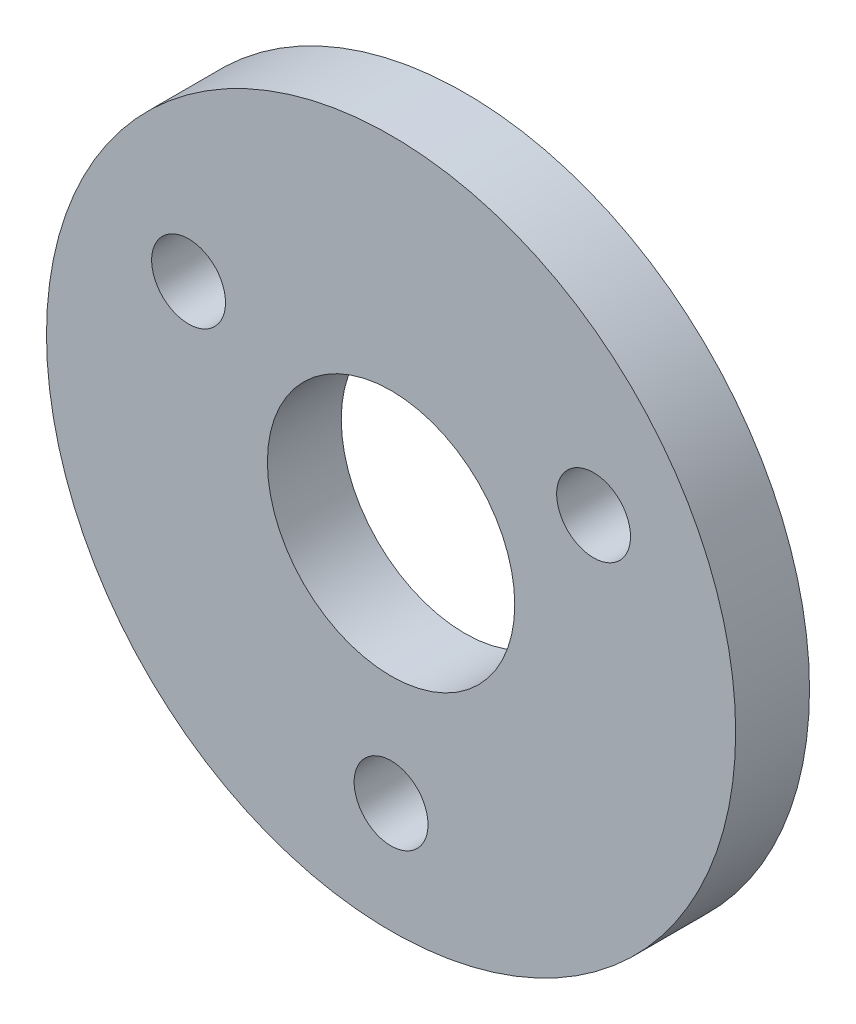
ISO-10303-21;
HEADER;
FILE_DESCRIPTION(('STEP AP214'),'2;1');
FILE_NAME('part.step','',(''),(''),'','','');
FILE_SCHEMA(('AUTOMOTIVE_DESIGN { 1 0 10303 214 1 1 1 1 }'));
ENDSEC;
DATA;
#1=APPLICATION_CONTEXT('core data for automotive mechanical design processes');
#2=APPLICATION_PROTOCOL_DEFINITION('international standard','automotive_design',2000,#1);
#3=PRODUCT_CONTEXT('',#1,'mechanical');
#4=PRODUCT('Part','Part','',(#3));
#5=PRODUCT_RELATED_PRODUCT_CATEGORY('part','',(#4));
#6=PRODUCT_DEFINITION_FORMATION('','',#4);
#7=PRODUCT_DEFINITION_CONTEXT('part definition',#1,'design');
#8=PRODUCT_DEFINITION('design','',#6,#7);
#9=PRODUCT_DEFINITION_SHAPE('','',#8);
#10=(LENGTH_UNIT() NAMED_UNIT(*) SI_UNIT(.MILLI.,.METRE.));
#11=(NAMED_UNIT(*) PLANE_ANGLE_UNIT() SI_UNIT($,.RADIAN.));
#12=(NAMED_UNIT(*) SI_UNIT($,.STERADIAN.) SOLID_ANGLE_UNIT());
#13=UNCERTAINTY_MEASURE_WITH_UNIT(LENGTH_MEASURE(1.E-05),#10,'distance_accuracy_value','');
#14=(GEOMETRIC_REPRESENTATION_CONTEXT(3) GLOBAL_UNCERTAINTY_ASSIGNED_CONTEXT((#13)) GLOBAL_UNIT_ASSIGNED_CONTEXT((#10,
#11,#12)) REPRESENTATION_CONTEXT('',''));
#15=CARTESIAN_POINT('',(0.,0.,0.));
#16=DIRECTION('',(0.,0.,1.));
#17=DIRECTION('',(1.,0.,0.));
#18=AXIS2_PLACEMENT_3D('',#15,#16,#17);
#19=CARTESIAN_POINT('',(0.,0.,3.));
#20=DIRECTION('',(0.,0.,1.));
#21=DIRECTION('',(1.,0.,0.));
#22=AXIS2_PLACEMENT_3D('',#19,#20,#21);
#23=PLANE('',#22);
#24=CARTESIAN_POINT('',(-8.22724133595208,4.75000000000015,3.));
#25=DIRECTION('',(0.,0.,1.));
#26=DIRECTION('',(1.,0.,0.));
#27=AXIS2_PLACEMENT_3D('',#24,#25,#26);
#28=CIRCLE('',#27,1.5);
#29=CARTESIAN_POINT('',(-6.72724133595208,4.75000000000015,3.));
#30=VERTEX_POINT('',#29);
#31=EDGE_CURVE('E55',#30,#30,#28,.T.);
#32=ORIENTED_EDGE('',*,*,#31,.F.);
#33=EDGE_LOOP('',(#32));
#34=FACE_BOUND('',#33,.T.);
#35=CARTESIAN_POINT('',(0.,0.,3.));
#36=DIRECTION('',(0.,0.,1.));
#37=DIRECTION('',(1.,0.,0.));
#38=AXIS2_PLACEMENT_3D('',#35,#36,#37);
#39=CIRCLE('',#38,5.025);
#40=CARTESIAN_POINT('',(5.025,0.,3.));
#41=VERTEX_POINT('',#40);
#42=EDGE_CURVE('E44',#41,#41,#39,.T.);
#43=ORIENTED_EDGE('',*,*,#42,.F.);
#44=EDGE_LOOP('',(#43));
#45=FACE_BOUND('',#44,.T.);
#46=CARTESIAN_POINT('',(0.,0.,3.));
#47=DIRECTION('',(0.,0.,1.));
#48=DIRECTION('',(1.,0.,0.));
#49=AXIS2_PLACEMENT_3D('',#46,#47,#48);
#50=CIRCLE('',#49,14.);
#51=CARTESIAN_POINT('',(14.,0.,3.));
#52=VERTEX_POINT('',#51);
#53=EDGE_CURVE('E10',#52,#52,#50,.T.);
#54=ORIENTED_EDGE('',*,*,#53,.T.);
#55=EDGE_LOOP('',(#54));
#56=FACE_BOUND('',#55,.T.);
#57=CARTESIAN_POINT('',(0.,-9.5,3.));
#58=DIRECTION('',(0.,0.,1.));
#59=DIRECTION('',(1.,0.,0.));
#60=AXIS2_PLACEMENT_3D('',#57,#58,#59);
#61=CIRCLE('',#60,1.5);
#62=CARTESIAN_POINT('',(1.5,-9.5,3.));
#63=VERTEX_POINT('',#62);
#64=EDGE_CURVE('E49',#63,#63,#61,.T.);
#65=ORIENTED_EDGE('',*,*,#64,.F.);
#66=EDGE_LOOP('',(#65));
#67=FACE_BOUND('',#66,.T.);
#68=CARTESIAN_POINT('',(8.22724133595221,4.74999999999992,3.));
#69=DIRECTION('',(0.,0.,1.));
#70=DIRECTION('',(1.,0.,0.));
#71=AXIS2_PLACEMENT_3D('',#68,#69,#70);
#72=CIRCLE('',#71,1.5);
#73=CARTESIAN_POINT('',(9.72724133595221,4.74999999999992,3.));
#74=VERTEX_POINT('',#73);
#75=EDGE_CURVE('E61',#74,#74,#72,.T.);
#76=ORIENTED_EDGE('',*,*,#75,.F.);
#77=EDGE_LOOP('',(#76));
#78=FACE_BOUND('',#77,.T.);
#79=ADVANCED_FACE('F33',(#34,#45,#56,#67,#78),#23,.T.);
#80=CARTESIAN_POINT('',(0.,0.,0.));
#81=DIRECTION('',(0.,0.,1.));
#82=DIRECTION('',(1.,0.,0.));
#83=AXIS2_PLACEMENT_3D('',#80,#81,#82);
#84=PLANE('',#83);
#85=CARTESIAN_POINT('',(0.,0.,0.));
#86=DIRECTION('',(0.,0.,1.));
#87=DIRECTION('',(1.,0.,0.));
#88=AXIS2_PLACEMENT_3D('',#85,#86,#87);
#89=CIRCLE('',#88,14.);
#90=CARTESIAN_POINT('',(14.,0.,0.));
#91=VERTEX_POINT('',#90);
#92=EDGE_CURVE('E37',#91,#91,#89,.T.);
#93=ORIENTED_EDGE('',*,*,#92,.F.);
#94=EDGE_LOOP('',(#93));
#95=FACE_BOUND('',#94,.T.);
#96=CARTESIAN_POINT('',(0.,0.,0.));
#97=DIRECTION('',(0.,0.,1.));
#98=DIRECTION('',(1.,0.,0.));
#99=AXIS2_PLACEMENT_3D('',#96,#97,#98);
#100=CIRCLE('',#99,5.025);
#101=CARTESIAN_POINT('',(5.025,0.,0.));
#102=VERTEX_POINT('',#101);
#103=EDGE_CURVE('E46',#102,#102,#100,.T.);
#104=ORIENTED_EDGE('',*,*,#103,.T.);
#105=EDGE_LOOP('',(#104));
#106=FACE_BOUND('',#105,.T.);
#107=CARTESIAN_POINT('',(0.,-9.5,0.));
#108=DIRECTION('',(0.,0.,1.));
#109=DIRECTION('',(1.,0.,0.));
#110=AXIS2_PLACEMENT_3D('',#107,#108,#109);
#111=CIRCLE('',#110,1.5);
#112=CARTESIAN_POINT('',(1.5,-9.5,0.));
#113=VERTEX_POINT('',#112);
#114=EDGE_CURVE('E52',#113,#113,#111,.T.);
#115=ORIENTED_EDGE('',*,*,#114,.T.);
#116=EDGE_LOOP('',(#115));
#117=FACE_BOUND('',#116,.T.);
#118=CARTESIAN_POINT('',(-8.22724133595208,4.75000000000015,0.));
#119=DIRECTION('',(0.,0.,1.));
#120=DIRECTION('',(1.,0.,0.));
#121=AXIS2_PLACEMENT_3D('',#118,#119,#120);
#122=CIRCLE('',#121,1.5);
#123=CARTESIAN_POINT('',(-6.72724133595208,4.75000000000015,0.));
#124=VERTEX_POINT('',#123);
#125=EDGE_CURVE('E58',#124,#124,#122,.T.);
#126=ORIENTED_EDGE('',*,*,#125,.T.);
#127=EDGE_LOOP('',(#126));
#128=FACE_BOUND('',#127,.T.);
#129=CARTESIAN_POINT('',(8.22724133595221,4.74999999999992,0.));
#130=DIRECTION('',(0.,0.,1.));
#131=DIRECTION('',(1.,0.,0.));
#132=AXIS2_PLACEMENT_3D('',#129,#130,#131);
#133=CIRCLE('',#132,1.5);
#134=CARTESIAN_POINT('',(9.72724133595221,4.74999999999992,0.));
#135=VERTEX_POINT('',#134);
#136=EDGE_CURVE('E64',#135,#135,#133,.T.);
#137=ORIENTED_EDGE('',*,*,#136,.T.);
#138=EDGE_LOOP('',(#137));
#139=FACE_BOUND('',#138,.T.);
#140=ADVANCED_FACE('F74',(#95,#106,#117,#128,#139),#84,.F.);
#141=CARTESIAN_POINT('',(0.,0.,3.));
#142=DIRECTION('',(0.,0.,-1.));
#143=DIRECTION('',(-1.,0.,0.));
#144=AXIS2_PLACEMENT_3D('',#141,#142,#143);
#145=CYLINDRICAL_SURFACE('',#144,14.);
#146=ORIENTED_EDGE('',*,*,#53,.F.);
#147=EDGE_LOOP('',(#146));
#148=FACE_BOUND('',#147,.T.);
#149=ORIENTED_EDGE('',*,*,#92,.T.);
#150=EDGE_LOOP('',(#149));
#151=FACE_BOUND('',#150,.T.);
#152=ADVANCED_FACE('F35',(#148,#151),#145,.T.);
#153=CARTESIAN_POINT('',(0.,0.,3.));
#154=DIRECTION('',(0.,0.,-1.));
#155=DIRECTION('',(-1.,0.,0.));
#156=AXIS2_PLACEMENT_3D('',#153,#154,#155);
#157=CYLINDRICAL_SURFACE('',#156,5.025);
#158=ORIENTED_EDGE('',*,*,#42,.T.);
#159=EDGE_LOOP('',(#158));
#160=FACE_BOUND('',#159,.T.);
#161=ORIENTED_EDGE('',*,*,#103,.F.);
#162=EDGE_LOOP('',(#161));
#163=FACE_BOUND('',#162,.T.);
#164=ADVANCED_FACE('F84',(#160,#163),#157,.F.);
#165=CARTESIAN_POINT('',(0.,-9.5,3.));
#166=DIRECTION('',(0.,0.,-1.));
#167=DIRECTION('',(-1.,0.,0.));
#168=AXIS2_PLACEMENT_3D('',#165,#166,#167);
#169=CYLINDRICAL_SURFACE('',#168,1.5);
#170=ORIENTED_EDGE('',*,*,#64,.T.);
#171=EDGE_LOOP('',(#170));
#172=FACE_BOUND('',#171,.T.);
#173=ORIENTED_EDGE('',*,*,#114,.F.);
#174=EDGE_LOOP('',(#173));
#175=FACE_BOUND('',#174,.T.);
#176=ADVANCED_FACE('F87',(#172,#175),#169,.F.);
#177=CARTESIAN_POINT('',(-8.22724133595208,4.75000000000015,3.));
#178=DIRECTION('',(0.,0.,-1.));
#179=DIRECTION('',(-1.,0.,0.));
#180=AXIS2_PLACEMENT_3D('',#177,#178,#179);
#181=CYLINDRICAL_SURFACE('',#180,1.5);
#182=ORIENTED_EDGE('',*,*,#31,.T.);
#183=EDGE_LOOP('',(#182));
#184=FACE_BOUND('',#183,.T.);
#185=ORIENTED_EDGE('',*,*,#125,.F.);
#186=EDGE_LOOP('',(#185));
#187=FACE_BOUND('',#186,.T.);
#188=ADVANCED_FACE('F91',(#184,#187),#181,.F.);
#189=CARTESIAN_POINT('',(8.22724133595221,4.74999999999992,3.));
#190=DIRECTION('',(0.,0.,-1.));
#191=DIRECTION('',(-1.,0.,0.));
#192=AXIS2_PLACEMENT_3D('',#189,#190,#191);
#193=CYLINDRICAL_SURFACE('',#192,1.5);
#194=ORIENTED_EDGE('',*,*,#75,.T.);
#195=EDGE_LOOP('',(#194));
#196=FACE_BOUND('',#195,.T.);
#197=ORIENTED_EDGE('',*,*,#136,.F.);
#198=EDGE_LOOP('',(#197));
#199=FACE_BOUND('',#198,.T.);
#200=ADVANCED_FACE('F70',(#196,#199),#193,.F.);
#201=CLOSED_SHELL('',(#79,#140,#152,#164,#176,#188,#200));
#202=MANIFOLD_SOLID_BREP('B2',#201);
#203=ADVANCED_BREP_SHAPE_REPRESENTATION('',(#18,#202),#14);
#204=SHAPE_DEFINITION_REPRESENTATION(#9,#203);
ENDSEC;
END-ISO-10303-21;
